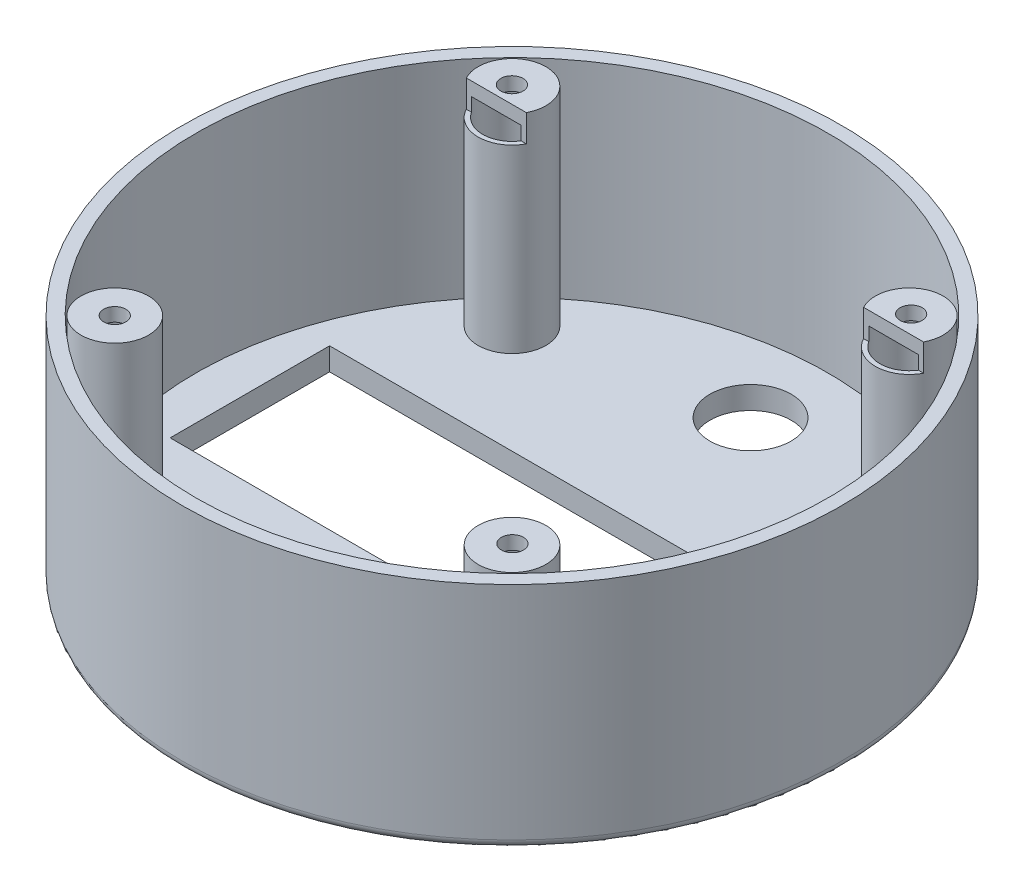
ISO-10303-21;
HEADER;
FILE_DESCRIPTION(('STEP AP214'),'2;1');
FILE_NAME('part.step','',(''),(''),'','','');
FILE_SCHEMA(('AUTOMOTIVE_DESIGN { 1 0 10303 214 1 1 1 1 }'));
ENDSEC;
DATA;
#1=APPLICATION_CONTEXT('core data for automotive mechanical design processes');
#2=APPLICATION_PROTOCOL_DEFINITION('international standard','automotive_design',2000,#1);
#3=PRODUCT_CONTEXT('',#1,'mechanical');
#4=PRODUCT('Part','Part','',(#3));
#5=PRODUCT_RELATED_PRODUCT_CATEGORY('part','',(#4));
#6=PRODUCT_DEFINITION_FORMATION('','',#4);
#7=PRODUCT_DEFINITION_CONTEXT('part definition',#1,'design');
#8=PRODUCT_DEFINITION('design','',#6,#7);
#9=PRODUCT_DEFINITION_SHAPE('','',#8);
#10=(LENGTH_UNIT() NAMED_UNIT(*) SI_UNIT(.MILLI.,.METRE.));
#11=(NAMED_UNIT(*) PLANE_ANGLE_UNIT() SI_UNIT($,.RADIAN.));
#12=(NAMED_UNIT(*) SI_UNIT($,.STERADIAN.) SOLID_ANGLE_UNIT());
#13=UNCERTAINTY_MEASURE_WITH_UNIT(LENGTH_MEASURE(1.E-05),#10,'distance_accuracy_value','');
#14=(GEOMETRIC_REPRESENTATION_CONTEXT(3) GLOBAL_UNCERTAINTY_ASSIGNED_CONTEXT((#13)) GLOBAL_UNIT_ASSIGNED_CONTEXT((#10,
#11,#12)) REPRESENTATION_CONTEXT('',''));
#15=CARTESIAN_POINT('',(0.,0.,0.));
#16=DIRECTION('',(0.,0.,1.));
#17=DIRECTION('',(1.,0.,0.));
#18=AXIS2_PLACEMENT_3D('',#15,#16,#17);
#19=CARTESIAN_POINT('',(-22.,0.,22.));
#20=DIRECTION('',(0.,1.,0.));
#21=DIRECTION('',(0.,0.,1.));
#22=AXIS2_PLACEMENT_3D('',#19,#20,#21);
#23=CYLINDRICAL_SURFACE('',#22,1.225);
#24=CARTESIAN_POINT('',(-22.,24.,22.));
#25=DIRECTION('',(0.,-1.,0.));
#26=DIRECTION('',(0.,0.,-1.));
#27=AXIS2_PLACEMENT_3D('',#24,#25,#26);
#28=CIRCLE('',#27,1.225);
#29=CARTESIAN_POINT('',(-22.,24.,20.775));
#30=VERTEX_POINT('',#29);
#31=EDGE_CURVE('E231',#30,#30,#28,.F.);
#32=ORIENTED_EDGE('',*,*,#31,.F.);
#33=EDGE_LOOP('',(#32));
#34=FACE_BOUND('',#33,.T.);
#35=CARTESIAN_POINT('',(-22.,25.5,22.));
#36=DIRECTION('',(0.,1.,0.));
#37=DIRECTION('',(0.,0.,1.));
#38=AXIS2_PLACEMENT_3D('',#35,#36,#37);
#39=CIRCLE('',#38,1.225);
#40=CARTESIAN_POINT('',(-22.,25.5,23.225));
#41=VERTEX_POINT('',#40);
#42=EDGE_CURVE('E194',#41,#41,#39,.F.);
#43=ORIENTED_EDGE('',*,*,#42,.F.);
#44=EDGE_LOOP('',(#43));
#45=FACE_BOUND('',#44,.T.);
#46=ADVANCED_FACE('F33',(#34,#45),#23,.F.);
#47=CARTESIAN_POINT('',(21.9598276122482,0.,-22.2466165056006));
#48=DIRECTION('',(0.,1.,0.));
#49=DIRECTION('',(0.,0.,1.));
#50=AXIS2_PLACEMENT_3D('',#47,#48,#49);
#51=CYLINDRICAL_SURFACE('',#50,1.225);
#52=CARTESIAN_POINT('',(21.9598276122482,24.,-22.2466165056006));
#53=DIRECTION('',(0.,-1.,0.));
#54=DIRECTION('',(0.,0.,-1.));
#55=AXIS2_PLACEMENT_3D('',#52,#53,#54);
#56=CIRCLE('',#55,1.225);
#57=CARTESIAN_POINT('',(21.9598276122482,24.,-23.4716165056006));
#58=VERTEX_POINT('',#57);
#59=EDGE_CURVE('E221',#58,#58,#56,.F.);
#60=ORIENTED_EDGE('',*,*,#59,.F.);
#61=EDGE_LOOP('',(#60));
#62=FACE_BOUND('',#61,.T.);
#63=CARTESIAN_POINT('',(21.9598276122482,25.5,-22.2466165056006));
#64=DIRECTION('',(0.,1.,0.));
#65=DIRECTION('',(0.,0.,1.));
#66=AXIS2_PLACEMENT_3D('',#63,#64,#65);
#67=CIRCLE('',#66,1.225);
#68=CARTESIAN_POINT('',(21.9598276122482,25.5,-21.0216165056006));
#69=VERTEX_POINT('',#68);
#70=EDGE_CURVE('E191',#69,#69,#67,.F.);
#71=ORIENTED_EDGE('',*,*,#70,.F.);
#72=EDGE_LOOP('',(#71));
#73=FACE_BOUND('',#72,.T.);
#74=ADVANCED_FACE('F312',(#62,#73),#51,.F.);
#75=CARTESIAN_POINT('',(-22.1450280282961,0.,-22.1353810563184));
#76=DIRECTION('',(0.,1.,0.));
#77=DIRECTION('',(0.,0.,1.));
#78=AXIS2_PLACEMENT_3D('',#75,#76,#77);
#79=CYLINDRICAL_SURFACE('',#78,1.225);
#80=CARTESIAN_POINT('',(-22.1450280282961,24.,-22.1353810563184));
#81=DIRECTION('',(0.,-1.,0.));
#82=DIRECTION('',(0.,0.,-1.));
#83=AXIS2_PLACEMENT_3D('',#80,#81,#82);
#84=CIRCLE('',#83,1.225);
#85=CARTESIAN_POINT('',(-22.1450280282961,24.,-23.3603810563184));
#86=VERTEX_POINT('',#85);
#87=EDGE_CURVE('E241',#86,#86,#84,.F.);
#88=ORIENTED_EDGE('',*,*,#87,.F.);
#89=EDGE_LOOP('',(#88));
#90=FACE_BOUND('',#89,.T.);
#91=CARTESIAN_POINT('',(-22.1450280282961,25.5,-22.1353810563184));
#92=DIRECTION('',(0.,1.,0.));
#93=DIRECTION('',(0.,0.,1.));
#94=AXIS2_PLACEMENT_3D('',#91,#92,#93);
#95=CIRCLE('',#94,1.225);
#96=CARTESIAN_POINT('',(-22.1450280282961,25.5,-20.9103810563184));
#97=VERTEX_POINT('',#96);
#98=EDGE_CURVE('E188',#97,#97,#95,.F.);
#99=ORIENTED_EDGE('',*,*,#98,.F.);
#100=EDGE_LOOP('',(#99));
#101=FACE_BOUND('',#100,.T.);
#102=ADVANCED_FACE('F309',(#90,#101),#79,.F.);
#103=CARTESIAN_POINT('',(21.9042098876064,0.,21.8582391349437));
#104=DIRECTION('',(0.,1.,0.));
#105=DIRECTION('',(0.,0.,1.));
#106=AXIS2_PLACEMENT_3D('',#103,#104,#105);
#107=CYLINDRICAL_SURFACE('',#106,1.225);
#108=CARTESIAN_POINT('',(21.9042098876064,24.,21.8582391349437));
#109=DIRECTION('',(0.,-1.,0.));
#110=DIRECTION('',(0.,0.,-1.));
#111=AXIS2_PLACEMENT_3D('',#108,#109,#110);
#112=CIRCLE('',#111,1.225);
#113=CARTESIAN_POINT('',(21.9042098876064,24.,20.6332391349437));
#114=VERTEX_POINT('',#113);
#115=EDGE_CURVE('E252',#114,#114,#112,.F.);
#116=ORIENTED_EDGE('',*,*,#115,.F.);
#117=EDGE_LOOP('',(#116));
#118=FACE_BOUND('',#117,.T.);
#119=CARTESIAN_POINT('',(21.9042098876064,25.5,21.8582391349437));
#120=DIRECTION('',(0.,1.,0.));
#121=DIRECTION('',(0.,0.,1.));
#122=AXIS2_PLACEMENT_3D('',#119,#120,#121);
#123=CIRCLE('',#122,1.225);
#124=CARTESIAN_POINT('',(21.9042098876064,25.5,23.0832391349437));
#125=VERTEX_POINT('',#124);
#126=EDGE_CURVE('E185',#125,#125,#123,.F.);
#127=ORIENTED_EDGE('',*,*,#126,.F.);
#128=EDGE_LOOP('',(#127));
#129=FACE_BOUND('',#128,.T.);
#130=ADVANCED_FACE('F311',(#118,#129),#107,.F.);
#131=CARTESIAN_POINT('',(0.,2.5,0.));
#132=DIRECTION('',(0.,-1.,0.));
#133=DIRECTION('',(0.,0.,-1.));
#134=AXIS2_PLACEMENT_3D('',#131,#132,#133);
#135=CYLINDRICAL_SURFACE('',#134,36.5);
#136=CARTESIAN_POINT('',(0.,1.,0.));
#137=DIRECTION('',(0.,1.,0.));
#138=DIRECTION('',(0.,0.,1.));
#139=AXIS2_PLACEMENT_3D('',#136,#137,#138);
#140=CIRCLE('',#139,36.5);
#141=CARTESIAN_POINT('',(0.,1.,36.5));
#142=VERTEX_POINT('',#141);
#143=EDGE_CURVE('E283',#142,#142,#140,.T.);
#144=ORIENTED_EDGE('',*,*,#143,.T.);
#145=EDGE_LOOP('',(#144));
#146=FACE_BOUND('',#145,.T.);
#147=CARTESIAN_POINT('',(0.,25.5,0.));
#148=DIRECTION('',(0.,1.,0.));
#149=DIRECTION('',(0.,0.,1.));
#150=AXIS2_PLACEMENT_3D('',#147,#148,#149);
#151=CIRCLE('',#150,36.5);
#152=CARTESIAN_POINT('',(0.,25.5,36.5));
#153=VERTEX_POINT('',#152);
#154=EDGE_CURVE('E171',#153,#153,#151,.T.);
#155=ORIENTED_EDGE('',*,*,#154,.F.);
#156=EDGE_LOOP('',(#155));
#157=FACE_BOUND('',#156,.T.);
#158=ADVANCED_FACE('F319',(#146,#157),#135,.T.);
#159=CARTESIAN_POINT('',(0.,37.5,0.));
#160=DIRECTION('',(0.,-1.,0.));
#161=DIRECTION('',(0.,0.,-1.));
#162=AXIS2_PLACEMENT_3D('',#159,#160,#161);
#163=CYLINDRICAL_SURFACE('',#162,35.);
#164=CARTESIAN_POINT('',(0.,2.5,0.));
#165=DIRECTION('',(0.,1.,0.));
#166=DIRECTION('',(0.,0.,1.));
#167=AXIS2_PLACEMENT_3D('',#164,#165,#166);
#168=CIRCLE('',#167,35.);
#169=CARTESIAN_POINT('',(0.,2.5,35.));
#170=VERTEX_POINT('',#169);
#171=EDGE_CURVE('E269',#170,#170,#168,.F.);
#172=ORIENTED_EDGE('',*,*,#171,.T.);
#173=EDGE_LOOP('',(#172));
#174=FACE_BOUND('',#173,.T.);
#175=CARTESIAN_POINT('',(0.,25.5,0.));
#176=DIRECTION('',(0.,1.,0.));
#177=DIRECTION('',(0.,0.,1.));
#178=AXIS2_PLACEMENT_3D('',#175,#176,#177);
#179=CIRCLE('',#178,35.);
#180=CARTESIAN_POINT('',(0.,25.5,35.));
#181=VERTEX_POINT('',#180);
#182=EDGE_CURVE('E182',#181,#181,#179,.T.);
#183=ORIENTED_EDGE('',*,*,#182,.T.);
#184=EDGE_LOOP('',(#183));
#185=FACE_BOUND('',#184,.T.);
#186=ADVANCED_FACE('F347',(#174,#185),#163,.F.);
#187=CARTESIAN_POINT('',(-22.,37.5,-22.));
#188=DIRECTION('',(0.,-1.,0.));
#189=DIRECTION('',(0.,0.,-1.));
#190=AXIS2_PLACEMENT_3D('',#187,#188,#189);
#191=CYLINDRICAL_SURFACE('',#190,3.75);
#192=CARTESIAN_POINT('',(-22.,25.5,-22.));
#193=DIRECTION('',(0.,1.,0.));
#194=DIRECTION('',(0.,0.,1.));
#195=AXIS2_PLACEMENT_3D('',#192,#193,#194);
#196=CIRCLE('',#195,3.75);
#197=CARTESIAN_POINT('',(-18.678045659694,25.5,-20.2601381201595));
#198=VERTEX_POINT('',#197);
#199=CARTESIAN_POINT('',(-25.321954340306,25.5,-20.2601381201595));
#200=VERTEX_POINT('',#199);
#201=EDGE_CURVE('E179',#198,#200,#196,.T.);
#202=ORIENTED_EDGE('',*,*,#201,.F.);
#203=DIRECTION('',(0.,-1.,0.));
#204=VECTOR('',#203,1.);
#205=CARTESIAN_POINT('',(-18.678045659694,37.5,-20.2601381201595));
#206=LINE('',#205,#204);
#207=CARTESIAN_POINT('',(-18.678045659694,22.5,-20.2601381201595));
#208=VERTEX_POINT('',#207);
#209=EDGE_CURVE('E166',#198,#208,#206,.T.);
#210=ORIENTED_EDGE('',*,*,#209,.T.);
#211=CARTESIAN_POINT('',(-22.,22.5,-22.));
#212=DIRECTION('',(0.,1.,0.));
#213=DIRECTION('',(0.,0.,1.));
#214=AXIS2_PLACEMENT_3D('',#211,#212,#213);
#215=CIRCLE('',#214,3.75);
#216=CARTESIAN_POINT('',(-25.321954340306,22.5,-20.2601381201595));
#217=VERTEX_POINT('',#216);
#218=EDGE_CURVE('E133',#217,#208,#215,.T.);
#219=ORIENTED_EDGE('',*,*,#218,.F.);
#220=DIRECTION('',(0.,1.,0.));
#221=VECTOR('',#220,1.);
#222=CARTESIAN_POINT('',(-25.321954340306,22.5,-20.2601381201595));
#223=LINE('',#222,#221);
#224=EDGE_CURVE('E148',#217,#200,#223,.T.);
#225=ORIENTED_EDGE('',*,*,#224,.T.);
#226=EDGE_LOOP('',(#202,#210,#219,#225));
#227=FACE_BOUND('',#226,.T.);
#228=CARTESIAN_POINT('',(-22.,2.5,-22.));
#229=DIRECTION('',(0.,1.,0.));
#230=DIRECTION('',(0.,0.,1.));
#231=AXIS2_PLACEMENT_3D('',#228,#229,#230);
#232=CIRCLE('',#231,3.75);
#233=CARTESIAN_POINT('',(-22.,2.5,-18.25));
#234=VERTEX_POINT('',#233);
#235=EDGE_CURVE('E266',#234,#234,#232,.T.);
#236=ORIENTED_EDGE('',*,*,#235,.T.);
#237=EDGE_LOOP('',(#236));
#238=FACE_BOUND('',#237,.T.);
#239=ADVANCED_FACE('F298',(#227,#238),#191,.T.);
#240=CARTESIAN_POINT('',(22.,37.5,-22.));
#241=DIRECTION('',(0.,-1.,0.));
#242=DIRECTION('',(0.,0.,-1.));
#243=AXIS2_PLACEMENT_3D('',#240,#241,#242);
#244=CYLINDRICAL_SURFACE('',#243,3.75);
#245=CARTESIAN_POINT('',(22.,25.5,-22.));
#246=DIRECTION('',(0.,1.,0.));
#247=DIRECTION('',(0.,0.,1.));
#248=AXIS2_PLACEMENT_3D('',#245,#246,#247);
#249=CIRCLE('',#248,3.75);
#250=CARTESIAN_POINT('',(25.321954340306,25.5,-20.2601381201595));
#251=VERTEX_POINT('',#250);
#252=CARTESIAN_POINT('',(18.678045659694,25.5,-20.2601381201595));
#253=VERTEX_POINT('',#252);
#254=EDGE_CURVE('E147',#251,#253,#249,.T.);
#255=ORIENTED_EDGE('',*,*,#254,.F.);
#256=DIRECTION('',(0.,1.,0.));
#257=VECTOR('',#256,1.);
#258=CARTESIAN_POINT('',(25.321954340306,22.5,-20.2601381201595));
#259=LINE('',#258,#257);
#260=CARTESIAN_POINT('',(25.321954340306,22.5,-20.2601381201595));
#261=VERTEX_POINT('',#260);
#262=EDGE_CURVE('E137',#261,#251,#259,.T.);
#263=ORIENTED_EDGE('',*,*,#262,.F.);
#264=CARTESIAN_POINT('',(22.,22.5,-22.));
#265=DIRECTION('',(0.,1.,0.));
#266=DIRECTION('',(0.,0.,1.));
#267=AXIS2_PLACEMENT_3D('',#264,#265,#266);
#268=CIRCLE('',#267,3.75);
#269=CARTESIAN_POINT('',(18.678045659694,22.5,-20.2601381201595));
#270=VERTEX_POINT('',#269);
#271=EDGE_CURVE('E124',#270,#261,#268,.T.);
#272=ORIENTED_EDGE('',*,*,#271,.F.);
#273=DIRECTION('',(0.,-1.,0.));
#274=VECTOR('',#273,1.);
#275=CARTESIAN_POINT('',(18.678045659694,37.5,-20.2601381201595));
#276=LINE('',#275,#274);
#277=EDGE_CURVE('E164',#270,#253,#276,.F.);
#278=ORIENTED_EDGE('',*,*,#277,.T.);
#279=EDGE_LOOP('',(#255,#263,#272,#278));
#280=FACE_BOUND('',#279,.T.);
#281=CARTESIAN_POINT('',(22.,2.5,-22.));
#282=DIRECTION('',(0.,1.,0.));
#283=DIRECTION('',(0.,0.,1.));
#284=AXIS2_PLACEMENT_3D('',#281,#282,#283);
#285=CIRCLE('',#284,3.75);
#286=CARTESIAN_POINT('',(22.,2.5,-18.25));
#287=VERTEX_POINT('',#286);
#288=EDGE_CURVE('E263',#287,#287,#285,.T.);
#289=ORIENTED_EDGE('',*,*,#288,.T.);
#290=EDGE_LOOP('',(#289));
#291=FACE_BOUND('',#290,.T.);
#292=ADVANCED_FACE('F144',(#280,#291),#244,.T.);
#293=CARTESIAN_POINT('',(22.,37.5,22.));
#294=DIRECTION('',(0.,-1.,0.));
#295=DIRECTION('',(0.,0.,-1.));
#296=AXIS2_PLACEMENT_3D('',#293,#294,#295);
#297=CYLINDRICAL_SURFACE('',#296,3.75);
#298=CARTESIAN_POINT('',(22.,2.5,22.));
#299=DIRECTION('',(0.,1.,0.));
#300=DIRECTION('',(0.,0.,1.));
#301=AXIS2_PLACEMENT_3D('',#298,#299,#300);
#302=CIRCLE('',#301,3.75);
#303=CARTESIAN_POINT('',(22.,2.5,25.75));
#304=VERTEX_POINT('',#303);
#305=EDGE_CURVE('E260',#304,#304,#302,.T.);
#306=ORIENTED_EDGE('',*,*,#305,.T.);
#307=EDGE_LOOP('',(#306));
#308=FACE_BOUND('',#307,.T.);
#309=CARTESIAN_POINT('',(22.,25.5,22.));
#310=DIRECTION('',(0.,1.,0.));
#311=DIRECTION('',(0.,0.,1.));
#312=AXIS2_PLACEMENT_3D('',#309,#310,#311);
#313=CIRCLE('',#312,3.75);
#314=CARTESIAN_POINT('',(22.,25.5,25.75));
#315=VERTEX_POINT('',#314);
#316=EDGE_CURVE('E175',#315,#315,#313,.T.);
#317=ORIENTED_EDGE('',*,*,#316,.F.);
#318=EDGE_LOOP('',(#317));
#319=FACE_BOUND('',#318,.T.);
#320=ADVANCED_FACE('F338',(#308,#319),#297,.T.);
#321=CARTESIAN_POINT('',(-22.,37.5,22.));
#322=DIRECTION('',(0.,-1.,0.));
#323=DIRECTION('',(0.,0.,-1.));
#324=AXIS2_PLACEMENT_3D('',#321,#322,#323);
#325=CYLINDRICAL_SURFACE('',#324,3.75);
#326=CARTESIAN_POINT('',(-22.,2.5,22.));
#327=DIRECTION('',(0.,1.,0.));
#328=DIRECTION('',(0.,0.,1.));
#329=AXIS2_PLACEMENT_3D('',#326,#327,#328);
#330=CIRCLE('',#329,3.75);
#331=CARTESIAN_POINT('',(-22.,2.5,25.75));
#332=VERTEX_POINT('',#331);
#333=EDGE_CURVE('E255',#332,#332,#330,.T.);
#334=ORIENTED_EDGE('',*,*,#333,.T.);
#335=EDGE_LOOP('',(#334));
#336=FACE_BOUND('',#335,.T.);
#337=CARTESIAN_POINT('',(-22.,25.5,22.));
#338=DIRECTION('',(0.,1.,0.));
#339=DIRECTION('',(0.,0.,1.));
#340=AXIS2_PLACEMENT_3D('',#337,#338,#339);
#341=CIRCLE('',#340,3.75);
#342=CARTESIAN_POINT('',(-22.,25.5,25.75));
#343=VERTEX_POINT('',#342);
#344=EDGE_CURVE('E174',#343,#343,#341,.T.);
#345=ORIENTED_EDGE('',*,*,#344,.F.);
#346=EDGE_LOOP('',(#345));
#347=FACE_BOUND('',#346,.T.);
#348=ADVANCED_FACE('F334',(#336,#347),#325,.T.);
#349=CARTESIAN_POINT('',(0.,0.,0.));
#350=DIRECTION('',(0.,1.,0.));
#351=DIRECTION('',(0.,0.,1.));
#352=AXIS2_PLACEMENT_3D('',#349,#350,#351);
#353=PLANE('',#352);
#354=CARTESIAN_POINT('',(0.,0.,0.));
#355=DIRECTION('',(0.,1.,0.));
#356=DIRECTION('',(0.,0.,1.));
#357=AXIS2_PLACEMENT_3D('',#354,#355,#356);
#358=CIRCLE('',#357,35.5);
#359=CARTESIAN_POINT('',(0.,0.,35.5));
#360=VERTEX_POINT('',#359);
#361=EDGE_CURVE('E286',#360,#360,#358,.F.);
#362=ORIENTED_EDGE('',*,*,#361,.T.);
#363=EDGE_LOOP('',(#362));
#364=FACE_BOUND('',#363,.T.);
#365=DIRECTION('',(1.,0.,0.));
#366=VECTOR('',#365,1.);
#367=CARTESIAN_POINT('',(30.2475426675297,0.,-9.99466305573261));
#368=LINE('',#367,#366);
#369=CARTESIAN_POINT('',(-30.2009668014087,0.,-9.99466305573262));
#370=VERTEX_POINT('',#369);
#371=CARTESIAN_POINT('',(30.2475426675297,0.,-9.99466305573261));
#372=VERTEX_POINT('',#371);
#373=EDGE_CURVE('E199',#370,#372,#368,.T.);
#374=ORIENTED_EDGE('',*,*,#373,.F.);
#375=DIRECTION('',(0.,0.,-1.));
#376=VECTOR('',#375,1.);
#377=CARTESIAN_POINT('',(-30.2009668014087,0.,-9.99466305573262));
#378=LINE('',#377,#376);
#379=CARTESIAN_POINT('',(-30.2009668014087,0.,7.66527536338511));
#380=VERTEX_POINT('',#379);
#381=EDGE_CURVE('E197',#380,#370,#378,.T.);
#382=ORIENTED_EDGE('',*,*,#381,.F.);
#383=DIRECTION('',(-1.,0.,0.));
#384=VECTOR('',#383,1.);
#385=CARTESIAN_POINT('',(30.2475426675297,0.,7.66527536338512));
#386=LINE('',#385,#384);
#387=CARTESIAN_POINT('',(30.2475426675297,0.,7.66527536338512));
#388=VERTEX_POINT('',#387);
#389=EDGE_CURVE('E205',#388,#380,#386,.T.);
#390=ORIENTED_EDGE('',*,*,#389,.F.);
#391=DIRECTION('',(0.,0.,1.));
#392=VECTOR('',#391,1.);
#393=CARTESIAN_POINT('',(30.2475426675297,0.,-9.99466305573261));
#394=LINE('',#393,#392);
#395=EDGE_CURVE('E202',#372,#388,#394,.T.);
#396=ORIENTED_EDGE('',*,*,#395,.F.);
#397=EDGE_LOOP('',(#374,#382,#390,#396));
#398=FACE_BOUND('',#397,.T.);
#399=CARTESIAN_POINT('',(0.,0.,-26.4189572958887));
#400=DIRECTION('',(0.,-1.,0.));
#401=DIRECTION('',(0.,0.,-1.));
#402=AXIS2_PLACEMENT_3D('',#399,#400,#401);
#403=CIRCLE('',#402,4.5);
#404=CARTESIAN_POINT('',(0.,0.,-30.9189572958887));
#405=VERTEX_POINT('',#404);
#406=EDGE_CURVE('E211',#405,#405,#403,.T.);
#407=ORIENTED_EDGE('',*,*,#406,.F.);
#408=EDGE_LOOP('',(#407));
#409=FACE_BOUND('',#408,.T.);
#410=CARTESIAN_POINT('',(22.,0.,-22.));
#411=DIRECTION('',(0.,-1.,0.));
#412=DIRECTION('',(0.,0.,-1.));
#413=AXIS2_PLACEMENT_3D('',#410,#411,#412);
#414=CIRCLE('',#413,3.25);
#415=CARTESIAN_POINT('',(22.,0.,-25.25));
#416=VERTEX_POINT('',#415);
#417=EDGE_CURVE('E225',#416,#416,#414,.T.);
#418=ORIENTED_EDGE('',*,*,#417,.F.);
#419=EDGE_LOOP('',(#418));
#420=FACE_BOUND('',#419,.T.);
#421=CARTESIAN_POINT('',(-22.,0.,22.));
#422=DIRECTION('',(0.,-1.,0.));
#423=DIRECTION('',(0.,0.,-1.));
#424=AXIS2_PLACEMENT_3D('',#421,#422,#423);
#425=CIRCLE('',#424,3.25);
#426=CARTESIAN_POINT('',(-22.,0.,18.75));
#427=VERTEX_POINT('',#426);
#428=EDGE_CURVE('E235',#427,#427,#425,.T.);
#429=ORIENTED_EDGE('',*,*,#428,.F.);
#430=EDGE_LOOP('',(#429));
#431=FACE_BOUND('',#430,.T.);
#432=CARTESIAN_POINT('',(-22.,0.,-22.));
#433=DIRECTION('',(0.,-1.,0.));
#434=DIRECTION('',(0.,0.,-1.));
#435=AXIS2_PLACEMENT_3D('',#432,#433,#434);
#436=CIRCLE('',#435,3.25);
#437=CARTESIAN_POINT('',(-22.,0.,-25.25));
#438=VERTEX_POINT('',#437);
#439=EDGE_CURVE('E244',#438,#438,#436,.T.);
#440=ORIENTED_EDGE('',*,*,#439,.F.);
#441=EDGE_LOOP('',(#440));
#442=FACE_BOUND('',#441,.T.);
#443=CARTESIAN_POINT('',(22.,0.,22.));
#444=DIRECTION('',(0.,-1.,0.));
#445=DIRECTION('',(0.,0.,-1.));
#446=AXIS2_PLACEMENT_3D('',#443,#444,#445);
#447=CIRCLE('',#446,3.25);
#448=CARTESIAN_POINT('',(22.,0.,18.75));
#449=VERTEX_POINT('',#448);
#450=EDGE_CURVE('E228',#449,#449,#447,.T.);
#451=ORIENTED_EDGE('',*,*,#450,.F.);
#452=EDGE_LOOP('',(#451));
#453=FACE_BOUND('',#452,.T.);
#454=ADVANCED_FACE('F337',(#364,#398,#409,#420,#431,#442,#453),#353,.F.);
#455=CARTESIAN_POINT('',(0.,2.5,0.));
#456=DIRECTION('',(0.,1.,0.));
#457=DIRECTION('',(0.,0.,1.));
#458=AXIS2_PLACEMENT_3D('',#455,#456,#457);
#459=PLANE('',#458);
#460=DIRECTION('',(0.,0.,1.));
#461=VECTOR('',#460,1.);
#462=CARTESIAN_POINT('',(-30.2009668014087,2.5,0.));
#463=LINE('',#462,#461);
#464=CARTESIAN_POINT('',(-30.2009668014087,2.5,-9.99466305573262));
#465=VERTEX_POINT('',#464);
#466=CARTESIAN_POINT('',(-30.2009668014087,2.5,7.66527536338511));
#467=VERTEX_POINT('',#466);
#468=EDGE_CURVE('E281',#465,#467,#463,.T.);
#469=ORIENTED_EDGE('',*,*,#468,.F.);
#470=DIRECTION('',(-1.,0.,0.));
#471=VECTOR('',#470,1.);
#472=CARTESIAN_POINT('',(0.,2.5,-9.99466305573261));
#473=LINE('',#472,#471);
#474=CARTESIAN_POINT('',(30.2475426675297,2.5,-9.99466305573261));
#475=VERTEX_POINT('',#474);
#476=EDGE_CURVE('E272',#475,#465,#473,.T.);
#477=ORIENTED_EDGE('',*,*,#476,.F.);
#478=DIRECTION('',(0.,0.,-1.));
#479=VECTOR('',#478,1.);
#480=CARTESIAN_POINT('',(30.2475426675297,2.5,0.));
#481=LINE('',#480,#479);
#482=CARTESIAN_POINT('',(30.2475426675297,2.5,7.66527536338512));
#483=VERTEX_POINT('',#482);
#484=EDGE_CURVE('E276',#483,#475,#481,.T.);
#485=ORIENTED_EDGE('',*,*,#484,.F.);
#486=DIRECTION('',(1.,0.,0.));
#487=VECTOR('',#486,1.);
#488=CARTESIAN_POINT('',(0.,2.5,7.66527536338511));
#489=LINE('',#488,#487);
#490=EDGE_CURVE('E279',#467,#483,#489,.T.);
#491=ORIENTED_EDGE('',*,*,#490,.F.);
#492=EDGE_LOOP('',(#469,#477,#485,#491));
#493=FACE_BOUND('',#492,.T.);
#494=CARTESIAN_POINT('',(0.,2.5,-26.4189572958887));
#495=DIRECTION('',(0.,1.,0.));
#496=DIRECTION('',(0.,0.,1.));
#497=AXIS2_PLACEMENT_3D('',#494,#495,#496);
#498=CIRCLE('',#497,4.5);
#499=CARTESIAN_POINT('',(0.,2.5,-21.9189572958887));
#500=VERTEX_POINT('',#499);
#501=EDGE_CURVE('E220',#500,#500,#498,.T.);
#502=ORIENTED_EDGE('',*,*,#501,.F.);
#503=EDGE_LOOP('',(#502));
#504=FACE_BOUND('',#503,.T.);
#505=ORIENTED_EDGE('',*,*,#333,.F.);
#506=EDGE_LOOP('',(#505));
#507=FACE_BOUND('',#506,.T.);
#508=ORIENTED_EDGE('',*,*,#305,.F.);
#509=EDGE_LOOP('',(#508));
#510=FACE_BOUND('',#509,.T.);
#511=ORIENTED_EDGE('',*,*,#288,.F.);
#512=EDGE_LOOP('',(#511));
#513=FACE_BOUND('',#512,.T.);
#514=ORIENTED_EDGE('',*,*,#235,.F.);
#515=EDGE_LOOP('',(#514));
#516=FACE_BOUND('',#515,.T.);
#517=ORIENTED_EDGE('',*,*,#171,.F.);
#518=EDGE_LOOP('',(#517));
#519=FACE_BOUND('',#518,.T.);
#520=ADVANCED_FACE('F351',(#493,#504,#507,#510,#513,#516,#519),#459,.T.);
#521=CARTESIAN_POINT('',(22.,24.,22.));
#522=DIRECTION('',(0.,-1.,0.));
#523=DIRECTION('',(0.,0.,-1.));
#524=AXIS2_PLACEMENT_3D('',#521,#522,#523);
#525=CYLINDRICAL_SURFACE('',#524,3.25);
#526=CARTESIAN_POINT('',(22.,24.,22.));
#527=DIRECTION('',(0.,-1.,0.));
#528=DIRECTION('',(0.,0.,-1.));
#529=AXIS2_PLACEMENT_3D('',#526,#527,#528);
#530=CIRCLE('',#529,3.25);
#531=CARTESIAN_POINT('',(22.,24.,18.75));
#532=VERTEX_POINT('',#531);
#533=EDGE_CURVE('E249',#532,#532,#530,.T.);
#534=ORIENTED_EDGE('',*,*,#533,.F.);
#535=EDGE_LOOP('',(#534));
#536=FACE_BOUND('',#535,.T.);
#537=ORIENTED_EDGE('',*,*,#450,.T.);
#538=EDGE_LOOP('',(#537));
#539=FACE_BOUND('',#538,.T.);
#540=ADVANCED_FACE('F354',(#536,#539),#525,.F.);
#541=CARTESIAN_POINT('',(0.,24.,0.));
#542=DIRECTION('',(0.,-1.,0.));
#543=DIRECTION('',(0.,0.,-1.));
#544=AXIS2_PLACEMENT_3D('',#541,#542,#543);
#545=PLANE('',#544);
#546=ORIENTED_EDGE('',*,*,#533,.T.);
#547=EDGE_LOOP('',(#546));
#548=FACE_BOUND('',#547,.T.);
#549=ORIENTED_EDGE('',*,*,#115,.T.);
#550=EDGE_LOOP('',(#549));
#551=FACE_BOUND('',#550,.T.);
#552=ADVANCED_FACE('F416',(#548,#551),#545,.T.);
#553=CARTESIAN_POINT('',(-22.,24.,-22.));
#554=DIRECTION('',(0.,-1.,0.));
#555=DIRECTION('',(0.,0.,-1.));
#556=AXIS2_PLACEMENT_3D('',#553,#554,#555);
#557=CYLINDRICAL_SURFACE('',#556,3.25);
#558=CARTESIAN_POINT('',(-22.,22.5,-22.));
#559=DIRECTION('',(0.,1.,0.));
#560=DIRECTION('',(0.,0.,1.));
#561=AXIS2_PLACEMENT_3D('',#558,#559,#560);
#562=CIRCLE('',#561,3.25);
#563=CARTESIAN_POINT('',(-19.2549352213331,22.5,-20.2601381201595));
#564=VERTEX_POINT('',#563);
#565=CARTESIAN_POINT('',(-24.7450647786669,22.5,-20.2601381201595));
#566=VERTEX_POINT('',#565);
#567=EDGE_CURVE('E134',#564,#566,#562,.F.);
#568=ORIENTED_EDGE('',*,*,#567,.F.);
#569=DIRECTION('',(0.,-1.,0.));
#570=VECTOR('',#569,1.);
#571=CARTESIAN_POINT('',(-19.2549352213331,24.,-20.2601381201595));
#572=LINE('',#571,#570);
#573=CARTESIAN_POINT('',(-19.2549352213331,24.,-20.2601381201595));
#574=VERTEX_POINT('',#573);
#575=EDGE_CURVE('E161',#564,#574,#572,.F.);
#576=ORIENTED_EDGE('',*,*,#575,.T.);
#577=CARTESIAN_POINT('',(-22.,24.,-22.));
#578=DIRECTION('',(0.,-1.,0.));
#579=DIRECTION('',(0.,0.,-1.));
#580=AXIS2_PLACEMENT_3D('',#577,#578,#579);
#581=CIRCLE('',#580,3.25);
#582=CARTESIAN_POINT('',(-24.7450647786669,24.,-20.2601381201595));
#583=VERTEX_POINT('',#582);
#584=EDGE_CURVE('E240',#583,#574,#581,.T.);
#585=ORIENTED_EDGE('',*,*,#584,.F.);
#586=DIRECTION('',(0.,-1.,0.));
#587=VECTOR('',#586,1.);
#588=CARTESIAN_POINT('',(-24.7450647786669,24.,-20.2601381201595));
#589=LINE('',#588,#587);
#590=EDGE_CURVE('E48',#583,#566,#589,.T.);
#591=ORIENTED_EDGE('',*,*,#590,.T.);
#592=EDGE_LOOP('',(#568,#576,#585,#591));
#593=FACE_BOUND('',#592,.T.);
#594=ORIENTED_EDGE('',*,*,#439,.T.);
#595=EDGE_LOOP('',(#594));
#596=FACE_BOUND('',#595,.T.);
#597=ADVANCED_FACE('F400',(#593,#596),#557,.F.);
#598=CARTESIAN_POINT('',(0.,24.,0.));
#599=DIRECTION('',(0.,-1.,0.));
#600=DIRECTION('',(0.,0.,-1.));
#601=AXIS2_PLACEMENT_3D('',#598,#599,#600);
#602=PLANE('',#601);
#603=DIRECTION('',(1.,0.,0.));
#604=VECTOR('',#603,1.);
#605=CARTESIAN_POINT('',(0.,24.,-20.2601381201595));
#606=LINE('',#605,#604);
#607=EDGE_CURVE('E158',#583,#574,#606,.T.);
#608=ORIENTED_EDGE('',*,*,#607,.F.);
#609=ORIENTED_EDGE('',*,*,#584,.T.);
#610=EDGE_LOOP('',(#608,#609));
#611=FACE_BOUND('',#610,.T.);
#612=ORIENTED_EDGE('',*,*,#87,.T.);
#613=EDGE_LOOP('',(#612));
#614=FACE_BOUND('',#613,.T.);
#615=ADVANCED_FACE('F404',(#611,#614),#602,.T.);
#616=CARTESIAN_POINT('',(22.,24.,-22.));
#617=DIRECTION('',(0.,-1.,0.));
#618=DIRECTION('',(0.,0.,-1.));
#619=AXIS2_PLACEMENT_3D('',#616,#617,#618);
#620=CYLINDRICAL_SURFACE('',#619,3.25);
#621=CARTESIAN_POINT('',(22.,22.5,-22.));
#622=DIRECTION('',(0.,1.,0.));
#623=DIRECTION('',(0.,0.,1.));
#624=AXIS2_PLACEMENT_3D('',#621,#622,#623);
#625=CIRCLE('',#624,3.25);
#626=CARTESIAN_POINT('',(24.7450647786669,22.5,-20.2601381201595));
#627=VERTEX_POINT('',#626);
#628=CARTESIAN_POINT('',(19.2549352213331,22.5,-20.2601381201595));
#629=VERTEX_POINT('',#628);
#630=EDGE_CURVE('E11',#627,#629,#625,.F.);
#631=ORIENTED_EDGE('',*,*,#630,.F.);
#632=DIRECTION('',(0.,-1.,0.));
#633=VECTOR('',#632,1.);
#634=CARTESIAN_POINT('',(24.7450647786669,24.,-20.2601381201595));
#635=LINE('',#634,#633);
#636=CARTESIAN_POINT('',(24.7450647786669,24.,-20.2601381201595));
#637=VERTEX_POINT('',#636);
#638=EDGE_CURVE('E140',#627,#637,#635,.F.);
#639=ORIENTED_EDGE('',*,*,#638,.T.);
#640=CARTESIAN_POINT('',(22.,24.,-22.));
#641=DIRECTION('',(0.,-1.,0.));
#642=DIRECTION('',(0.,0.,-1.));
#643=AXIS2_PLACEMENT_3D('',#640,#641,#642);
#644=CIRCLE('',#643,3.25);
#645=CARTESIAN_POINT('',(19.2549352213331,24.,-20.2601381201595));
#646=VERTEX_POINT('',#645);
#647=EDGE_CURVE('E224',#646,#637,#644,.T.);
#648=ORIENTED_EDGE('',*,*,#647,.F.);
#649=DIRECTION('',(0.,-1.,0.));
#650=VECTOR('',#649,1.);
#651=CARTESIAN_POINT('',(19.2549352213331,24.,-20.2601381201595));
#652=LINE('',#651,#650);
#653=EDGE_CURVE('E56',#646,#629,#652,.T.);
#654=ORIENTED_EDGE('',*,*,#653,.T.);
#655=EDGE_LOOP('',(#631,#639,#648,#654));
#656=FACE_BOUND('',#655,.T.);
#657=ORIENTED_EDGE('',*,*,#417,.T.);
#658=EDGE_LOOP('',(#657));
#659=FACE_BOUND('',#658,.T.);
#660=ADVANCED_FACE('F407',(#656,#659),#620,.F.);
#661=CARTESIAN_POINT('',(0.,24.,0.));
#662=DIRECTION('',(0.,-1.,0.));
#663=DIRECTION('',(0.,0.,-1.));
#664=AXIS2_PLACEMENT_3D('',#661,#662,#663);
#665=PLANE('',#664);
#666=DIRECTION('',(1.,0.,0.));
#667=VECTOR('',#666,1.);
#668=CARTESIAN_POINT('',(0.,24.,-20.2601381201595));
#669=LINE('',#668,#667);
#670=EDGE_CURVE('E151',#646,#637,#669,.T.);
#671=ORIENTED_EDGE('',*,*,#670,.F.);
#672=ORIENTED_EDGE('',*,*,#647,.T.);
#673=EDGE_LOOP('',(#671,#672));
#674=FACE_BOUND('',#673,.T.);
#675=ORIENTED_EDGE('',*,*,#59,.T.);
#676=EDGE_LOOP('',(#675));
#677=FACE_BOUND('',#676,.T.);
#678=ADVANCED_FACE('F413',(#674,#677),#665,.T.);
#679=CARTESIAN_POINT('',(-22.,24.,22.));
#680=DIRECTION('',(0.,-1.,0.));
#681=DIRECTION('',(0.,0.,-1.));
#682=AXIS2_PLACEMENT_3D('',#679,#680,#681);
#683=CYLINDRICAL_SURFACE('',#682,3.25);
#684=CARTESIAN_POINT('',(-22.,24.,22.));
#685=DIRECTION('',(0.,-1.,0.));
#686=DIRECTION('',(0.,0.,-1.));
#687=AXIS2_PLACEMENT_3D('',#684,#685,#686);
#688=CIRCLE('',#687,3.25);
#689=CARTESIAN_POINT('',(-22.,24.,18.75));
#690=VERTEX_POINT('',#689);
#691=EDGE_CURVE('E232',#690,#690,#688,.T.);
#692=ORIENTED_EDGE('',*,*,#691,.F.);
#693=EDGE_LOOP('',(#692));
#694=FACE_BOUND('',#693,.T.);
#695=ORIENTED_EDGE('',*,*,#428,.T.);
#696=EDGE_LOOP('',(#695));
#697=FACE_BOUND('',#696,.T.);
#698=ADVANCED_FACE('F419',(#694,#697),#683,.F.);
#699=CARTESIAN_POINT('',(0.,24.,0.));
#700=DIRECTION('',(0.,-1.,0.));
#701=DIRECTION('',(0.,0.,-1.));
#702=AXIS2_PLACEMENT_3D('',#699,#700,#701);
#703=PLANE('',#702);
#704=ORIENTED_EDGE('',*,*,#691,.T.);
#705=EDGE_LOOP('',(#704));
#706=FACE_BOUND('',#705,.T.);
#707=ORIENTED_EDGE('',*,*,#31,.T.);
#708=EDGE_LOOP('',(#707));
#709=FACE_BOUND('',#708,.T.);
#710=ADVANCED_FACE('F626',(#706,#709),#703,.T.);
#711=CARTESIAN_POINT('',(0.,10.,-26.4189572958887));
#712=DIRECTION('',(0.,-1.,0.));
#713=DIRECTION('',(0.,0.,-1.));
#714=AXIS2_PLACEMENT_3D('',#711,#712,#713);
#715=CYLINDRICAL_SURFACE('',#714,4.5);
#716=ORIENTED_EDGE('',*,*,#501,.T.);
#717=EDGE_LOOP('',(#716));
#718=FACE_BOUND('',#717,.T.);
#719=ORIENTED_EDGE('',*,*,#406,.T.);
#720=EDGE_LOOP('',(#719));
#721=FACE_BOUND('',#720,.T.);
#722=ADVANCED_FACE('F618',(#718,#721),#715,.F.);
#723=CARTESIAN_POINT('',(-30.2009668014087,10.,-9.99466305573262));
#724=DIRECTION('',(-1.,0.,0.));
#725=DIRECTION('',(0.,0.,1.));
#726=AXIS2_PLACEMENT_3D('',#723,#724,#725);
#727=PLANE('',#726);
#728=ORIENTED_EDGE('',*,*,#468,.T.);
#729=DIRECTION('',(0.,-1.,0.));
#730=VECTOR('',#729,1.);
#731=CARTESIAN_POINT('',(-30.2009668014087,10.,7.66527536338511));
#732=LINE('',#731,#730);
#733=EDGE_CURVE('E209',#467,#380,#732,.T.);
#734=ORIENTED_EDGE('',*,*,#733,.T.);
#735=ORIENTED_EDGE('',*,*,#381,.T.);
#736=DIRECTION('',(0.,-1.,0.));
#737=VECTOR('',#736,1.);
#738=CARTESIAN_POINT('',(-30.2009668014087,10.,-9.99466305573262));
#739=LINE('',#738,#737);
#740=EDGE_CURVE('E208',#465,#370,#739,.T.);
#741=ORIENTED_EDGE('',*,*,#740,.F.);
#742=EDGE_LOOP('',(#728,#734,#735,#741));
#743=FACE_BOUND('',#742,.T.);
#744=ADVANCED_FACE('F611',(#743),#727,.F.);
#745=CARTESIAN_POINT('',(30.2475426675297,10.,7.66527536338512));
#746=DIRECTION('',(0.,0.,1.));
#747=DIRECTION('',(1.,0.,0.));
#748=AXIS2_PLACEMENT_3D('',#745,#746,#747);
#749=PLANE('',#748);
#750=ORIENTED_EDGE('',*,*,#490,.T.);
#751=DIRECTION('',(0.,-1.,0.));
#752=VECTOR('',#751,1.);
#753=CARTESIAN_POINT('',(30.2475426675297,10.,7.66527536338512));
#754=LINE('',#753,#752);
#755=EDGE_CURVE('E212',#483,#388,#754,.T.);
#756=ORIENTED_EDGE('',*,*,#755,.T.);
#757=ORIENTED_EDGE('',*,*,#389,.T.);
#758=ORIENTED_EDGE('',*,*,#733,.F.);
#759=EDGE_LOOP('',(#750,#756,#757,#758));
#760=FACE_BOUND('',#759,.T.);
#761=ADVANCED_FACE('F603',(#760),#749,.F.);
#762=CARTESIAN_POINT('',(30.2475426675297,10.,-9.99466305573261));
#763=DIRECTION('',(1.,0.,0.));
#764=DIRECTION('',(0.,0.,-1.));
#765=AXIS2_PLACEMENT_3D('',#762,#763,#764);
#766=PLANE('',#765);
#767=ORIENTED_EDGE('',*,*,#484,.T.);
#768=DIRECTION('',(0.,-1.,0.));
#769=VECTOR('',#768,1.);
#770=CARTESIAN_POINT('',(30.2475426675297,10.,-9.99466305573261));
#771=LINE('',#770,#769);
#772=EDGE_CURVE('E214',#475,#372,#771,.T.);
#773=ORIENTED_EDGE('',*,*,#772,.T.);
#774=ORIENTED_EDGE('',*,*,#395,.T.);
#775=ORIENTED_EDGE('',*,*,#755,.F.);
#776=EDGE_LOOP('',(#767,#773,#774,#775));
#777=FACE_BOUND('',#776,.T.);
#778=ADVANCED_FACE('F598',(#777),#766,.F.);
#779=CARTESIAN_POINT('',(30.2475426675297,10.,-9.99466305573261));
#780=DIRECTION('',(0.,0.,-1.));
#781=DIRECTION('',(-1.,0.,0.));
#782=AXIS2_PLACEMENT_3D('',#779,#780,#781);
#783=PLANE('',#782);
#784=ORIENTED_EDGE('',*,*,#476,.T.);
#785=ORIENTED_EDGE('',*,*,#740,.T.);
#786=ORIENTED_EDGE('',*,*,#373,.T.);
#787=ORIENTED_EDGE('',*,*,#772,.F.);
#788=EDGE_LOOP('',(#784,#785,#786,#787));
#789=FACE_BOUND('',#788,.T.);
#790=ADVANCED_FACE('F547',(#789),#783,.F.);
#791=CARTESIAN_POINT('',(0.,1.,0.));
#792=DIRECTION('',(0.,1.,0.));
#793=DIRECTION('',(0.,0.,1.));
#794=AXIS2_PLACEMENT_3D('',#791,#792,#793);
#795=TOROIDAL_SURFACE('',#794,35.5,1.);
#796=ORIENTED_EDGE('',*,*,#361,.F.);
#797=EDGE_LOOP('',(#796));
#798=FACE_BOUND('',#797,.T.);
#799=ORIENTED_EDGE('',*,*,#143,.F.);
#800=EDGE_LOOP('',(#799));
#801=FACE_BOUND('',#800,.T.);
#802=ADVANCED_FACE('F35',(#798,#801),#795,.T.);
#803=CARTESIAN_POINT('',(0.,25.5,0.));
#804=DIRECTION('',(0.,1.,0.));
#805=DIRECTION('',(0.,0.,1.));
#806=AXIS2_PLACEMENT_3D('',#803,#804,#805);
#807=PLANE('',#806);
#808=ORIENTED_EDGE('',*,*,#344,.T.);
#809=EDGE_LOOP('',(#808));
#810=FACE_BOUND('',#809,.T.);
#811=ORIENTED_EDGE('',*,*,#42,.T.);
#812=EDGE_LOOP('',(#811));
#813=FACE_BOUND('',#812,.T.);
#814=ADVANCED_FACE('F368',(#810,#813),#807,.T.);
#815=ORIENTED_EDGE('',*,*,#316,.T.);
#816=EDGE_LOOP('',(#815));
#817=FACE_BOUND('',#816,.T.);
#818=ORIENTED_EDGE('',*,*,#126,.T.);
#819=EDGE_LOOP('',(#818));
#820=FACE_BOUND('',#819,.T.);
#821=ADVANCED_FACE('F306',(#817,#820),#807,.T.);
#822=DIRECTION('',(-1.,0.,0.));
#823=VECTOR('',#822,1.);
#824=CARTESIAN_POINT('',(25.321954340306,25.5,-20.2601381201595));
#825=LINE('',#824,#823);
#826=EDGE_CURVE('E392',#251,#253,#825,.T.);
#827=ORIENTED_EDGE('',*,*,#826,.F.);
#828=ORIENTED_EDGE('',*,*,#254,.T.);
#829=EDGE_LOOP('',(#827,#828));
#830=FACE_BOUND('',#829,.T.);
#831=ORIENTED_EDGE('',*,*,#70,.T.);
#832=EDGE_LOOP('',(#831));
#833=FACE_BOUND('',#832,.T.);
#834=ADVANCED_FACE('F304',(#830,#833),#807,.T.);
#835=DIRECTION('',(-1.,0.,0.));
#836=VECTOR('',#835,1.);
#837=CARTESIAN_POINT('',(0.,25.5,-20.2601381201595));
#838=LINE('',#837,#836);
#839=EDGE_CURVE('E41',#198,#200,#838,.T.);
#840=ORIENTED_EDGE('',*,*,#839,.F.);
#841=ORIENTED_EDGE('',*,*,#201,.T.);
#842=EDGE_LOOP('',(#840,#841));
#843=FACE_BOUND('',#842,.T.);
#844=ORIENTED_EDGE('',*,*,#98,.T.);
#845=EDGE_LOOP('',(#844));
#846=FACE_BOUND('',#845,.T.);
#847=ADVANCED_FACE('F300',(#843,#846),#807,.T.);
#848=ORIENTED_EDGE('',*,*,#182,.F.);
#849=EDGE_LOOP('',(#848));
#850=FACE_BOUND('',#849,.T.);
#851=ORIENTED_EDGE('',*,*,#154,.T.);
#852=EDGE_LOOP('',(#851));
#853=FACE_BOUND('',#852,.T.);
#854=ADVANCED_FACE('F303',(#850,#853),#807,.T.);
#855=CARTESIAN_POINT('',(25.321954340306,22.5,-20.2601381201595));
#856=DIRECTION('',(0.,0.,-1.));
#857=DIRECTION('',(-1.,0.,0.));
#858=AXIS2_PLACEMENT_3D('',#855,#856,#857);
#859=PLANE('',#858);
#860=ORIENTED_EDGE('',*,*,#839,.T.);
#861=ORIENTED_EDGE('',*,*,#224,.F.);
#862=DIRECTION('',(-1.,0.,0.));
#863=VECTOR('',#862,1.);
#864=CARTESIAN_POINT('',(25.321954340306,22.5,-20.2601381201595));
#865=LINE('',#864,#863);
#866=EDGE_CURVE('E142',#566,#217,#865,.T.);
#867=ORIENTED_EDGE('',*,*,#866,.F.);
#868=ORIENTED_EDGE('',*,*,#590,.F.);
#869=ORIENTED_EDGE('',*,*,#607,.T.);
#870=ORIENTED_EDGE('',*,*,#575,.F.);
#871=EDGE_CURVE('E395',#208,#564,#865,.T.);
#872=ORIENTED_EDGE('',*,*,#871,.F.);
#873=ORIENTED_EDGE('',*,*,#209,.F.);
#874=EDGE_LOOP('',(#860,#861,#867,#868,#869,#870,#872,#873));
#875=FACE_BOUND('',#874,.T.);
#876=ADVANCED_FACE('F292',(#875),#859,.F.);
#877=CARTESIAN_POINT('',(0.,22.5,0.));
#878=DIRECTION('',(0.,1.,0.));
#879=DIRECTION('',(0.,0.,1.));
#880=AXIS2_PLACEMENT_3D('',#877,#878,#879);
#881=PLANE('',#880);
#882=ORIENTED_EDGE('',*,*,#218,.T.);
#883=ORIENTED_EDGE('',*,*,#871,.T.);
#884=ORIENTED_EDGE('',*,*,#567,.T.);
#885=ORIENTED_EDGE('',*,*,#866,.T.);
#886=EDGE_LOOP('',(#882,#883,#884,#885));
#887=FACE_BOUND('',#886,.T.);
#888=ADVANCED_FACE('F372',(#887),#881,.T.);
#889=ORIENTED_EDGE('',*,*,#271,.T.);
#890=EDGE_CURVE('E127',#261,#627,#865,.T.);
#891=ORIENTED_EDGE('',*,*,#890,.T.);
#892=ORIENTED_EDGE('',*,*,#630,.T.);
#893=EDGE_CURVE('E129',#629,#270,#865,.T.);
#894=ORIENTED_EDGE('',*,*,#893,.T.);
#895=EDGE_LOOP('',(#889,#891,#892,#894));
#896=FACE_BOUND('',#895,.T.);
#897=ADVANCED_FACE('F126',(#896),#881,.T.);
#898=ORIENTED_EDGE('',*,*,#893,.F.);
#899=ORIENTED_EDGE('',*,*,#653,.F.);
#900=ORIENTED_EDGE('',*,*,#670,.T.);
#901=ORIENTED_EDGE('',*,*,#638,.F.);
#902=ORIENTED_EDGE('',*,*,#890,.F.);
#903=ORIENTED_EDGE('',*,*,#262,.T.);
#904=ORIENTED_EDGE('',*,*,#826,.T.);
#905=ORIENTED_EDGE('',*,*,#277,.F.);
#906=EDGE_LOOP('',(#898,#899,#900,#901,#902,#903,#904,#905));
#907=FACE_BOUND('',#906,.T.);
#908=ADVANCED_FACE('F136',(#907),#859,.F.);
#909=CLOSED_SHELL('',(#46,#74,#102,#130,#158,#186,#239,#292,#320,#348,#454,#520,#540,#552,#597,
#615,#660,#678,#698,#710,#722,#744,#761,#778,#790,#802,#814,#821,#834,#847,#854,#876,#888,#897,#908));
#910=MANIFOLD_SOLID_BREP('B2',#909);
#911=ADVANCED_BREP_SHAPE_REPRESENTATION('',(#18,#910),#14);
#912=SHAPE_DEFINITION_REPRESENTATION(#9,#911);
ENDSEC;
END-ISO-10303-21;
